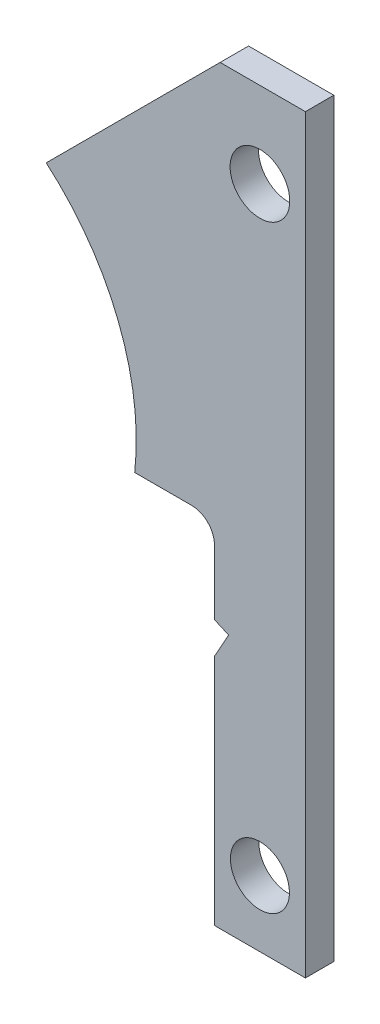
ISO-10303-21;
HEADER;
FILE_DESCRIPTION(('STEP AP214'),'2;1');
FILE_NAME('part.step','',(''),(''),'','','');
FILE_SCHEMA(('AUTOMOTIVE_DESIGN { 1 0 10303 214 1 1 1 1 }'));
ENDSEC;
DATA;
#1=APPLICATION_CONTEXT('core data for automotive mechanical design processes');
#2=APPLICATION_PROTOCOL_DEFINITION('international standard','automotive_design',2000,#1);
#3=PRODUCT_CONTEXT('',#1,'mechanical');
#4=PRODUCT('Part','Part','',(#3));
#5=PRODUCT_RELATED_PRODUCT_CATEGORY('part','',(#4));
#6=PRODUCT_DEFINITION_FORMATION('','',#4);
#7=PRODUCT_DEFINITION_CONTEXT('part definition',#1,'design');
#8=PRODUCT_DEFINITION('design','',#6,#7);
#9=PRODUCT_DEFINITION_SHAPE('','',#8);
#10=(LENGTH_UNIT() NAMED_UNIT(*) SI_UNIT(.MILLI.,.METRE.));
#11=(NAMED_UNIT(*) PLANE_ANGLE_UNIT() SI_UNIT($,.RADIAN.));
#12=(NAMED_UNIT(*) SI_UNIT($,.STERADIAN.) SOLID_ANGLE_UNIT());
#13=UNCERTAINTY_MEASURE_WITH_UNIT(LENGTH_MEASURE(1.E-05),#10,'distance_accuracy_value','');
#14=(GEOMETRIC_REPRESENTATION_CONTEXT(3) GLOBAL_UNCERTAINTY_ASSIGNED_CONTEXT((#13)) GLOBAL_UNIT_ASSIGNED_CONTEXT((#10,
#11,#12)) REPRESENTATION_CONTEXT('',''));
#15=CARTESIAN_POINT('',(0.,0.,0.));
#16=DIRECTION('',(0.,0.,1.));
#17=DIRECTION('',(1.,0.,0.));
#18=AXIS2_PLACEMENT_3D('',#15,#16,#17);
#19=CARTESIAN_POINT('',(795.076378776782,63.8094152835061,5.));
#20=DIRECTION('',(0.,0.,1.));
#21=DIRECTION('',(1.,0.,0.));
#22=AXIS2_PLACEMENT_3D('',#19,#20,#21);
#23=PLANE('',#22);
#24=CARTESIAN_POINT('',(794.600000000013,64.8000047087015,5.));
#25=DIRECTION('',(0.,0.,1.));
#26=DIRECTION('',(1.,0.,0.));
#27=AXIS2_PLACEMENT_3D('',#24,#25,#26);
#28=CIRCLE('',#27,45.25);
#29=CARTESIAN_POINT('',(839.572908511693,59.8000047087005,5.));
#30=VERTEX_POINT('',#29);
#31=CARTESIAN_POINT('',(823.998765650113,99.1987703588013,5.));
#32=VERTEX_POINT('',#31);
#33=EDGE_CURVE('E48',#30,#32,#28,.T.);
#34=ORIENTED_EDGE('',*,*,#33,.F.);
#35=DIRECTION('',(1.,0.,0.));
#36=VECTOR('',#35,1.);
#37=CARTESIAN_POINT('',(820.028101645404,59.8000047086987,5.));
#38=LINE('',#37,#36);
#39=CARTESIAN_POINT('',(849.600001490012,59.8000047087015,5.));
#40=VERTEX_POINT('',#39);
#41=EDGE_CURVE('E99',#30,#40,#38,.T.);
#42=ORIENTED_EDGE('',*,*,#41,.T.);
#43=CARTESIAN_POINT('',(849.600001490012,55.8000047087015,5.));
#44=DIRECTION('',(0.,0.,-1.));
#45=DIRECTION('',(1.,0.,0.));
#46=AXIS2_PLACEMENT_3D('',#43,#44,#45);
#47=CIRCLE('',#46,4.);
#48=CARTESIAN_POINT('',(853.600001490012,55.8000047087015,5.));
#49=VERTEX_POINT('',#48);
#50=EDGE_CURVE('E184',#40,#49,#47,.T.);
#51=ORIENTED_EDGE('',*,*,#50,.T.);
#52=DIRECTION('',(0.,-1.,0.));
#53=VECTOR('',#52,1.);
#54=CARTESIAN_POINT('',(853.600001490012,55.8000047087015,5.));
#55=LINE('',#54,#53);
#56=CARTESIAN_POINT('',(853.600001490012,44.4001544028015,5.));
#57=VERTEX_POINT('',#56);
#58=EDGE_CURVE('E206',#49,#57,#55,.T.);
#59=ORIENTED_EDGE('',*,*,#58,.T.);
#60=DIRECTION('',(0.915294684400679,-0.402784856601961,0.));
#61=VECTOR('',#60,1.);
#62=CARTESIAN_POINT('',(853.600001490012,44.4001544028015,5.));
#63=LINE('',#62,#61);
#64=CARTESIAN_POINT('',(856.099999798813,43.3000043883015,5.));
#65=VERTEX_POINT('',#64);
#66=EDGE_CURVE('E203',#57,#65,#63,.T.);
#67=ORIENTED_EDGE('',*,*,#66,.T.);
#68=DIRECTION('',(-0.488075249911389,-0.872801552716272,0.));
#69=VECTOR('',#68,1.);
#70=CARTESIAN_POINT('',(856.099999798813,43.3000043883015,5.));
#71=LINE('',#70,#69);
#72=CARTESIAN_POINT('',(853.600001490012,38.8293773567015,5.));
#73=VERTEX_POINT('',#72);
#74=EDGE_CURVE('E205',#65,#73,#71,.T.);
#75=ORIENTED_EDGE('',*,*,#74,.T.);
#76=DIRECTION('',(0.,-1.,0.));
#77=VECTOR('',#76,1.);
#78=CARTESIAN_POINT('',(853.600001490012,38.8293773567015,5.));
#79=LINE('',#78,#77);
#80=CARTESIAN_POINT('',(853.600001490012,-2.19999390319852,5.));
#81=VERTEX_POINT('',#80);
#82=EDGE_CURVE('E125',#73,#81,#79,.T.);
#83=ORIENTED_EDGE('',*,*,#82,.T.);
#84=DIRECTION('',(1.,0.,0.));
#85=VECTOR('',#84,1.);
#86=CARTESIAN_POINT('',(853.600001490012,-2.19999390319852,5.));
#87=LINE('',#86,#85);
#88=CARTESIAN_POINT('',(869.600000000013,-2.19999390319852,5.));
#89=VERTEX_POINT('',#88);
#90=EDGE_CURVE('E118',#81,#89,#87,.T.);
#91=ORIENTED_EDGE('',*,*,#90,.T.);
#92=DIRECTION('',(0.,1.,0.));
#93=VECTOR('',#92,1.);
#94=CARTESIAN_POINT('',(869.600000000013,-2.19999390319852,5.));
#95=LINE('',#94,#93);
#96=CARTESIAN_POINT('',(869.600000000013,129.800004708701,5.));
#97=VERTEX_POINT('',#96);
#98=EDGE_CURVE('E122',#89,#97,#95,.T.);
#99=ORIENTED_EDGE('',*,*,#98,.T.);
#100=DIRECTION('',(-1.,0.,0.));
#101=VECTOR('',#100,1.);
#102=CARTESIAN_POINT('',(869.600000000013,129.800004708701,5.));
#103=LINE('',#102,#101);
#104=CARTESIAN_POINT('',(854.600000000013,129.800004708701,5.));
#105=VERTEX_POINT('',#104);
#106=EDGE_CURVE('E56',#97,#105,#103,.T.);
#107=ORIENTED_EDGE('',*,*,#106,.T.);
#108=DIRECTION('',(-0.707106781186541,-0.707106781186555,0.));
#109=VECTOR('',#108,1.);
#110=CARTESIAN_POINT('',(854.600000000013,129.800004708701,5.));
#111=LINE('',#110,#109);
#112=EDGE_CURVE('E222',#105,#32,#111,.T.);
#113=ORIENTED_EDGE('',*,*,#112,.T.);
#114=EDGE_LOOP('',(#34,#42,#51,#59,#67,#75,#83,#91,#99,#107,#113));
#115=FACE_BOUND('',#114,.T.);
#116=CARTESIAN_POINT('',(861.600000000013,9.39149717140147,5.));
#117=DIRECTION('',(0.,0.,1.));
#118=DIRECTION('',(1.,0.,0.));
#119=AXIS2_PLACEMENT_3D('',#116,#117,#118);
#120=CIRCLE('',#119,5.19190313570428);
#121=CARTESIAN_POINT('',(866.791903135717,9.39149717140147,5.));
#122=VERTEX_POINT('',#121);
#123=EDGE_CURVE('E149',#122,#122,#120,.T.);
#124=ORIENTED_EDGE('',*,*,#123,.F.);
#125=EDGE_LOOP('',(#124));
#126=FACE_BOUND('',#125,.T.);
#127=CARTESIAN_POINT('',(861.600000000013,114.800004708701,5.));
#128=DIRECTION('',(0.,0.,1.));
#129=DIRECTION('',(1.,0.,0.));
#130=AXIS2_PLACEMENT_3D('',#127,#128,#129);
#131=CIRCLE('',#130,5.24999999999987);
#132=CARTESIAN_POINT('',(866.850000000012,114.800004708701,5.));
#133=VERTEX_POINT('',#132);
#134=EDGE_CURVE('E216',#133,#133,#131,.T.);
#135=ORIENTED_EDGE('',*,*,#134,.F.);
#136=EDGE_LOOP('',(#135));
#137=FACE_BOUND('',#136,.T.);
#138=ADVANCED_FACE('F33',(#115,#126,#137),#23,.T.);
#139=CARTESIAN_POINT('',(795.076378776782,63.8094152835061,0.));
#140=DIRECTION('',(0.,0.,1.));
#141=DIRECTION('',(1.,0.,0.));
#142=AXIS2_PLACEMENT_3D('',#139,#140,#141);
#143=PLANE('',#142);
#144=DIRECTION('',(1.,0.,0.));
#145=VECTOR('',#144,1.);
#146=CARTESIAN_POINT('',(820.028101645404,59.8000047086987,0.));
#147=LINE('',#146,#145);
#148=CARTESIAN_POINT('',(839.572908511693,59.8000047087005,0.));
#149=VERTEX_POINT('',#148);
#150=CARTESIAN_POINT('',(849.600001490012,59.8000047087015,0.));
#151=VERTEX_POINT('',#150);
#152=EDGE_CURVE('E146',#149,#151,#147,.T.);
#153=ORIENTED_EDGE('',*,*,#152,.F.);
#154=CARTESIAN_POINT('',(794.600000000013,64.8000047087015,0.));
#155=DIRECTION('',(0.,0.,-1.));
#156=DIRECTION('',(-1.,0.,0.));
#157=AXIS2_PLACEMENT_3D('',#154,#155,#156);
#158=CIRCLE('',#157,45.25);
#159=CARTESIAN_POINT('',(823.998765650113,99.1987703588012,0.));
#160=VERTEX_POINT('',#159);
#161=EDGE_CURVE('E233',#160,#149,#158,.T.);
#162=ORIENTED_EDGE('',*,*,#161,.F.);
#163=DIRECTION('',(-0.707106781186541,-0.707106781186555,0.));
#164=VECTOR('',#163,1.);
#165=CARTESIAN_POINT('',(854.600000000013,129.800004708701,0.));
#166=LINE('',#165,#164);
#167=CARTESIAN_POINT('',(854.600000000013,129.800004708701,0.));
#168=VERTEX_POINT('',#167);
#169=EDGE_CURVE('E225',#168,#160,#166,.T.);
#170=ORIENTED_EDGE('',*,*,#169,.F.);
#171=DIRECTION('',(-1.,0.,0.));
#172=VECTOR('',#171,1.);
#173=CARTESIAN_POINT('',(869.600000000013,129.800004708701,0.));
#174=LINE('',#173,#172);
#175=CARTESIAN_POINT('',(869.600000000013,129.800004708701,0.));
#176=VERTEX_POINT('',#175);
#177=EDGE_CURVE('E92',#176,#168,#174,.T.);
#178=ORIENTED_EDGE('',*,*,#177,.F.);
#179=DIRECTION('',(0.,1.,0.));
#180=VECTOR('',#179,1.);
#181=CARTESIAN_POINT('',(869.600000000013,-2.19999390319852,0.));
#182=LINE('',#181,#180);
#183=CARTESIAN_POINT('',(869.600000000013,-2.19999390319852,0.));
#184=VERTEX_POINT('',#183);
#185=EDGE_CURVE('E160',#184,#176,#182,.T.);
#186=ORIENTED_EDGE('',*,*,#185,.F.);
#187=DIRECTION('',(1.,0.,0.));
#188=VECTOR('',#187,1.);
#189=CARTESIAN_POINT('',(853.600001490012,-2.19999390319852,0.));
#190=LINE('',#189,#188);
#191=CARTESIAN_POINT('',(853.600001490012,-2.19999390319852,0.));
#192=VERTEX_POINT('',#191);
#193=EDGE_CURVE('E134',#192,#184,#190,.T.);
#194=ORIENTED_EDGE('',*,*,#193,.F.);
#195=DIRECTION('',(0.,-1.,0.));
#196=VECTOR('',#195,1.);
#197=CARTESIAN_POINT('',(853.600001490012,38.8293773567015,0.));
#198=LINE('',#197,#196);
#199=CARTESIAN_POINT('',(853.600001490012,38.8293773567015,0.));
#200=VERTEX_POINT('',#199);
#201=EDGE_CURVE('E157',#200,#192,#198,.T.);
#202=ORIENTED_EDGE('',*,*,#201,.F.);
#203=DIRECTION('',(-0.488075249911389,-0.872801552716272,0.));
#204=VECTOR('',#203,1.);
#205=CARTESIAN_POINT('',(856.099999798813,43.3000043883015,0.));
#206=LINE('',#205,#204);
#207=CARTESIAN_POINT('',(856.099999798813,43.3000043883015,0.));
#208=VERTEX_POINT('',#207);
#209=EDGE_CURVE('E155',#208,#200,#206,.T.);
#210=ORIENTED_EDGE('',*,*,#209,.F.);
#211=DIRECTION('',(0.915294684400679,-0.402784856601961,0.));
#212=VECTOR('',#211,1.);
#213=CARTESIAN_POINT('',(853.600001490012,44.4001544028015,0.));
#214=LINE('',#213,#212);
#215=CARTESIAN_POINT('',(853.600001490012,44.4001544028015,0.));
#216=VERTEX_POINT('',#215);
#217=EDGE_CURVE('E153',#216,#208,#214,.T.);
#218=ORIENTED_EDGE('',*,*,#217,.F.);
#219=DIRECTION('',(0.,-1.,0.));
#220=VECTOR('',#219,1.);
#221=CARTESIAN_POINT('',(853.600001490012,55.8000047087015,0.));
#222=LINE('',#221,#220);
#223=CARTESIAN_POINT('',(853.600001490012,55.8000047087015,0.));
#224=VERTEX_POINT('',#223);
#225=EDGE_CURVE('E151',#224,#216,#222,.T.);
#226=ORIENTED_EDGE('',*,*,#225,.F.);
#227=CARTESIAN_POINT('',(849.600001490012,55.8000047087015,0.));
#228=DIRECTION('',(0.,0.,-1.));
#229=DIRECTION('',(1.,0.,0.));
#230=AXIS2_PLACEMENT_3D('',#227,#228,#229);
#231=CIRCLE('',#230,4.);
#232=EDGE_CURVE('E148',#151,#224,#231,.T.);
#233=ORIENTED_EDGE('',*,*,#232,.F.);
#234=EDGE_LOOP('',(#153,#162,#170,#178,#186,#194,#202,#210,#218,#226,#233));
#235=FACE_BOUND('',#234,.T.);
#236=CARTESIAN_POINT('',(861.600000000013,114.800004708701,0.));
#237=DIRECTION('',(0.,0.,1.));
#238=DIRECTION('',(1.,0.,0.));
#239=AXIS2_PLACEMENT_3D('',#236,#237,#238);
#240=CIRCLE('',#239,5.24999999999987);
#241=CARTESIAN_POINT('',(866.850000000012,114.800004708701,0.));
#242=VERTEX_POINT('',#241);
#243=EDGE_CURVE('E219',#242,#242,#240,.T.);
#244=ORIENTED_EDGE('',*,*,#243,.T.);
#245=EDGE_LOOP('',(#244));
#246=FACE_BOUND('',#245,.T.);
#247=CARTESIAN_POINT('',(861.600000000013,9.39149717140147,0.));
#248=DIRECTION('',(0.,0.,1.));
#249=DIRECTION('',(1.,0.,0.));
#250=AXIS2_PLACEMENT_3D('',#247,#248,#249);
#251=CIRCLE('',#250,5.19190313570428);
#252=CARTESIAN_POINT('',(866.791903135717,9.39149717140147,0.));
#253=VERTEX_POINT('',#252);
#254=EDGE_CURVE('E213',#253,#253,#251,.T.);
#255=ORIENTED_EDGE('',*,*,#254,.T.);
#256=EDGE_LOOP('',(#255));
#257=FACE_BOUND('',#256,.T.);
#258=ADVANCED_FACE('F189',(#235,#246,#257),#143,.F.);
#259=CARTESIAN_POINT('',(820.028101645404,59.8000047086987,5.));
#260=DIRECTION('',(0.,1.,0.));
#261=DIRECTION('',(-1.,0.,0.));
#262=AXIS2_PLACEMENT_3D('',#259,#260,#261);
#263=PLANE('',#262);
#264=ORIENTED_EDGE('',*,*,#41,.F.);
#265=DIRECTION('',(0.,0.,-1.));
#266=VECTOR('',#265,1.);
#267=CARTESIAN_POINT('',(839.572908511693,59.8000047087005,6.));
#268=LINE('',#267,#266);
#269=EDGE_CURVE('E228',#30,#149,#268,.T.);
#270=ORIENTED_EDGE('',*,*,#269,.T.);
#271=ORIENTED_EDGE('',*,*,#152,.T.);
#272=DIRECTION('',(0.,0.,-1.));
#273=VECTOR('',#272,1.);
#274=CARTESIAN_POINT('',(849.600001490012,59.8000047087015,5.));
#275=LINE('',#274,#273);
#276=EDGE_CURVE('E41',#40,#151,#275,.T.);
#277=ORIENTED_EDGE('',*,*,#276,.F.);
#278=EDGE_LOOP('',(#264,#270,#271,#277));
#279=FACE_BOUND('',#278,.T.);
#280=ADVANCED_FACE('F35',(#279),#263,.F.);
#281=CARTESIAN_POINT('',(849.600001490012,55.8000047087015,5.));
#282=DIRECTION('',(0.,0.,-1.));
#283=DIRECTION('',(-1.,0.,0.));
#284=AXIS2_PLACEMENT_3D('',#281,#282,#283);
#285=CYLINDRICAL_SURFACE('',#284,4.);
#286=ORIENTED_EDGE('',*,*,#232,.T.);
#287=DIRECTION('',(0.,0.,-1.));
#288=VECTOR('',#287,1.);
#289=CARTESIAN_POINT('',(853.600001490012,55.8000047087015,5.));
#290=LINE('',#289,#288);
#291=EDGE_CURVE('E176',#49,#224,#290,.T.);
#292=ORIENTED_EDGE('',*,*,#291,.F.);
#293=ORIENTED_EDGE('',*,*,#50,.F.);
#294=ORIENTED_EDGE('',*,*,#276,.T.);
#295=EDGE_LOOP('',(#286,#292,#293,#294));
#296=FACE_BOUND('',#295,.T.);
#297=ADVANCED_FACE('F182',(#296),#285,.F.);
#298=CARTESIAN_POINT('',(853.600001490012,55.8000047087015,5.));
#299=DIRECTION('',(1.,0.,0.));
#300=DIRECTION('',(0.,0.,-1.));
#301=AXIS2_PLACEMENT_3D('',#298,#299,#300);
#302=PLANE('',#301);
#303=ORIENTED_EDGE('',*,*,#225,.T.);
#304=DIRECTION('',(0.,0.,-1.));
#305=VECTOR('',#304,1.);
#306=CARTESIAN_POINT('',(853.600001490012,44.4001544028015,5.));
#307=LINE('',#306,#305);
#308=EDGE_CURVE('E173',#57,#216,#307,.T.);
#309=ORIENTED_EDGE('',*,*,#308,.F.);
#310=ORIENTED_EDGE('',*,*,#58,.F.);
#311=ORIENTED_EDGE('',*,*,#291,.T.);
#312=EDGE_LOOP('',(#303,#309,#310,#311));
#313=FACE_BOUND('',#312,.T.);
#314=ADVANCED_FACE('F197',(#313),#302,.F.);
#315=CARTESIAN_POINT('',(853.600001490012,44.4001544028015,5.));
#316=DIRECTION('',(0.402784856601961,0.915294684400679,0.));
#317=DIRECTION('',(-0.915294684400679,0.402784856601961,0.));
#318=AXIS2_PLACEMENT_3D('',#315,#316,#317);
#319=PLANE('',#318);
#320=ORIENTED_EDGE('',*,*,#217,.T.);
#321=DIRECTION('',(0.,0.,-1.));
#322=VECTOR('',#321,1.);
#323=CARTESIAN_POINT('',(856.099999798813,43.3000043883015,5.));
#324=LINE('',#323,#322);
#325=EDGE_CURVE('E170',#65,#208,#324,.T.);
#326=ORIENTED_EDGE('',*,*,#325,.F.);
#327=ORIENTED_EDGE('',*,*,#66,.F.);
#328=ORIENTED_EDGE('',*,*,#308,.T.);
#329=EDGE_LOOP('',(#320,#326,#327,#328));
#330=FACE_BOUND('',#329,.T.);
#331=ADVANCED_FACE('F201',(#330),#319,.F.);
#332=CARTESIAN_POINT('',(856.099999798813,43.3000043883015,5.));
#333=DIRECTION('',(0.872801552716272,-0.488075249911389,0.));
#334=DIRECTION('',(0.488075249911389,0.872801552716272,0.));
#335=AXIS2_PLACEMENT_3D('',#332,#333,#334);
#336=PLANE('',#335);
#337=ORIENTED_EDGE('',*,*,#209,.T.);
#338=DIRECTION('',(0.,0.,-1.));
#339=VECTOR('',#338,1.);
#340=CARTESIAN_POINT('',(853.600001490012,38.8293773567015,5.));
#341=LINE('',#340,#339);
#342=EDGE_CURVE('E167',#73,#200,#341,.T.);
#343=ORIENTED_EDGE('',*,*,#342,.F.);
#344=ORIENTED_EDGE('',*,*,#74,.F.);
#345=ORIENTED_EDGE('',*,*,#325,.T.);
#346=EDGE_LOOP('',(#337,#343,#344,#345));
#347=FACE_BOUND('',#346,.T.);
#348=ADVANCED_FACE('F261',(#347),#336,.F.);
#349=CARTESIAN_POINT('',(853.600001490012,38.8293773567015,5.));
#350=DIRECTION('',(1.,0.,0.));
#351=DIRECTION('',(0.,0.,-1.));
#352=AXIS2_PLACEMENT_3D('',#349,#350,#351);
#353=PLANE('',#352);
#354=ORIENTED_EDGE('',*,*,#201,.T.);
#355=DIRECTION('',(0.,0.,-1.));
#356=VECTOR('',#355,1.);
#357=CARTESIAN_POINT('',(853.600001490012,-2.19999390319852,5.));
#358=LINE('',#357,#356);
#359=EDGE_CURVE('E137',#81,#192,#358,.T.);
#360=ORIENTED_EDGE('',*,*,#359,.F.);
#361=ORIENTED_EDGE('',*,*,#82,.F.);
#362=ORIENTED_EDGE('',*,*,#342,.T.);
#363=EDGE_LOOP('',(#354,#360,#361,#362));
#364=FACE_BOUND('',#363,.T.);
#365=ADVANCED_FACE('F258',(#364),#353,.F.);
#366=CARTESIAN_POINT('',(853.600001490012,-2.19999390319852,5.));
#367=DIRECTION('',(0.,1.,0.));
#368=DIRECTION('',(0.,0.,1.));
#369=AXIS2_PLACEMENT_3D('',#366,#367,#368);
#370=PLANE('',#369);
#371=ORIENTED_EDGE('',*,*,#193,.T.);
#372=DIRECTION('',(0.,0.,-1.));
#373=VECTOR('',#372,1.);
#374=CARTESIAN_POINT('',(869.600000000013,-2.19999390319852,5.));
#375=LINE('',#374,#373);
#376=EDGE_CURVE('E131',#89,#184,#375,.T.);
#377=ORIENTED_EDGE('',*,*,#376,.F.);
#378=ORIENTED_EDGE('',*,*,#90,.F.);
#379=ORIENTED_EDGE('',*,*,#359,.T.);
#380=EDGE_LOOP('',(#371,#377,#378,#379));
#381=FACE_BOUND('',#380,.T.);
#382=ADVANCED_FACE('F132',(#381),#370,.F.);
#383=CARTESIAN_POINT('',(869.600000000013,-2.19999390319852,5.));
#384=DIRECTION('',(-1.,0.,0.));
#385=DIRECTION('',(0.,0.,1.));
#386=AXIS2_PLACEMENT_3D('',#383,#384,#385);
#387=PLANE('',#386);
#388=ORIENTED_EDGE('',*,*,#185,.T.);
#389=DIRECTION('',(0.,0.,-1.));
#390=VECTOR('',#389,1.);
#391=CARTESIAN_POINT('',(869.600000000013,129.800004708701,5.));
#392=LINE('',#391,#390);
#393=EDGE_CURVE('E138',#97,#176,#392,.T.);
#394=ORIENTED_EDGE('',*,*,#393,.F.);
#395=ORIENTED_EDGE('',*,*,#98,.F.);
#396=ORIENTED_EDGE('',*,*,#376,.T.);
#397=EDGE_LOOP('',(#388,#394,#395,#396));
#398=FACE_BOUND('',#397,.T.);
#399=ADVANCED_FACE('F140',(#398),#387,.F.);
#400=CARTESIAN_POINT('',(869.600000000013,129.800004708701,5.));
#401=DIRECTION('',(0.,-1.,0.));
#402=DIRECTION('',(0.,0.,-1.));
#403=AXIS2_PLACEMENT_3D('',#400,#401,#402);
#404=PLANE('',#403);
#405=ORIENTED_EDGE('',*,*,#177,.T.);
#406=DIRECTION('',(0.,0.,-1.));
#407=VECTOR('',#406,1.);
#408=CARTESIAN_POINT('',(854.600000000013,129.800004708701,5.));
#409=LINE('',#408,#407);
#410=EDGE_CURVE('E142',#105,#168,#409,.T.);
#411=ORIENTED_EDGE('',*,*,#410,.F.);
#412=ORIENTED_EDGE('',*,*,#106,.F.);
#413=ORIENTED_EDGE('',*,*,#393,.T.);
#414=EDGE_LOOP('',(#405,#411,#412,#413));
#415=FACE_BOUND('',#414,.T.);
#416=ADVANCED_FACE('F251',(#415),#404,.F.);
#417=CARTESIAN_POINT('',(861.600000000013,9.39149717140147,5.));
#418=DIRECTION('',(0.,0.,-1.));
#419=DIRECTION('',(-1.,0.,0.));
#420=AXIS2_PLACEMENT_3D('',#417,#418,#419);
#421=CYLINDRICAL_SURFACE('',#420,5.19190313570428);
#422=ORIENTED_EDGE('',*,*,#123,.T.);
#423=EDGE_LOOP('',(#422));
#424=FACE_BOUND('',#423,.T.);
#425=ORIENTED_EDGE('',*,*,#254,.F.);
#426=EDGE_LOOP('',(#425));
#427=FACE_BOUND('',#426,.T.);
#428=ADVANCED_FACE('F248',(#424,#427),#421,.F.);
#429=CARTESIAN_POINT('',(861.600000000013,114.800004708701,5.));
#430=DIRECTION('',(0.,0.,-1.));
#431=DIRECTION('',(-1.,0.,0.));
#432=AXIS2_PLACEMENT_3D('',#429,#430,#431);
#433=CYLINDRICAL_SURFACE('',#432,5.24999999999987);
#434=ORIENTED_EDGE('',*,*,#134,.T.);
#435=EDGE_LOOP('',(#434));
#436=FACE_BOUND('',#435,.T.);
#437=ORIENTED_EDGE('',*,*,#243,.F.);
#438=EDGE_LOOP('',(#437));
#439=FACE_BOUND('',#438,.T.);
#440=ADVANCED_FACE('F304',(#436,#439),#433,.F.);
#441=CARTESIAN_POINT('',(854.600000000013,129.800004708701,5.));
#442=DIRECTION('',(0.707106781186555,-0.707106781186541,0.));
#443=DIRECTION('',(0.707106781186541,0.707106781186555,0.));
#444=AXIS2_PLACEMENT_3D('',#441,#442,#443);
#445=PLANE('',#444);
#446=ORIENTED_EDGE('',*,*,#169,.T.);
#447=DIRECTION('',(0.,0.,-1.));
#448=VECTOR('',#447,1.);
#449=CARTESIAN_POINT('',(823.998765650113,99.1987703588012,6.));
#450=LINE('',#449,#448);
#451=EDGE_CURVE('E11',#160,#32,#450,.F.);
#452=ORIENTED_EDGE('',*,*,#451,.T.);
#453=ORIENTED_EDGE('',*,*,#112,.F.);
#454=ORIENTED_EDGE('',*,*,#410,.T.);
#455=EDGE_LOOP('',(#446,#452,#453,#454));
#456=FACE_BOUND('',#455,.T.);
#457=ADVANCED_FACE('F310',(#456),#445,.F.);
#458=CARTESIAN_POINT('',(794.600000000013,64.8000047087015,6.));
#459=DIRECTION('',(0.,0.,-1.));
#460=DIRECTION('',(-1.,0.,0.));
#461=AXIS2_PLACEMENT_3D('',#458,#459,#460);
#462=CYLINDRICAL_SURFACE('',#461,45.25);
#463=ORIENTED_EDGE('',*,*,#33,.T.);
#464=ORIENTED_EDGE('',*,*,#451,.F.);
#465=ORIENTED_EDGE('',*,*,#161,.T.);
#466=ORIENTED_EDGE('',*,*,#269,.F.);
#467=EDGE_LOOP('',(#463,#464,#465,#466));
#468=FACE_BOUND('',#467,.T.);
#469=ADVANCED_FACE('F235',(#468),#462,.F.);
#470=CLOSED_SHELL('',(#138,#258,#280,#297,#314,#331,#348,#365,#382,#399,#416,#428,#440,#457,#469));
#471=MANIFOLD_SOLID_BREP('B2',#470);
#472=ADVANCED_BREP_SHAPE_REPRESENTATION('',(#18,#471),#14);
#473=SHAPE_DEFINITION_REPRESENTATION(#9,#472);
ENDSEC;
END-ISO-10303-21;
